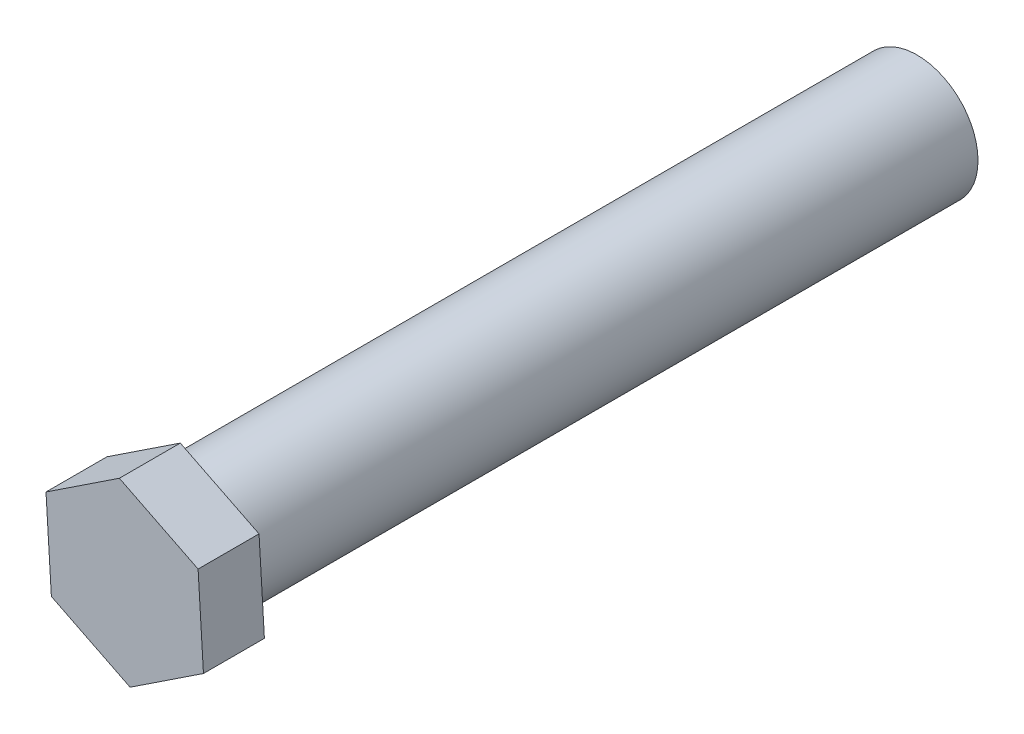
ISO-10303-21;
HEADER;
FILE_DESCRIPTION(('STEP AP214'),'2;1');
FILE_NAME('part.step','',(''),(''),'','','');
FILE_SCHEMA(('AUTOMOTIVE_DESIGN { 1 0 10303 214 1 1 1 1 }'));
ENDSEC;
DATA;
#1=APPLICATION_CONTEXT('core data for automotive mechanical design processes');
#2=APPLICATION_PROTOCOL_DEFINITION('international standard','automotive_design',2000,#1);
#3=PRODUCT_CONTEXT('',#1,'mechanical');
#4=PRODUCT('Part','Part','',(#3));
#5=PRODUCT_RELATED_PRODUCT_CATEGORY('part','',(#4));
#6=PRODUCT_DEFINITION_FORMATION('','',#4);
#7=PRODUCT_DEFINITION_CONTEXT('part definition',#1,'design');
#8=PRODUCT_DEFINITION('design','',#6,#7);
#9=PRODUCT_DEFINITION_SHAPE('','',#8);
#10=(LENGTH_UNIT() NAMED_UNIT(*) SI_UNIT(.MILLI.,.METRE.));
#11=(NAMED_UNIT(*) PLANE_ANGLE_UNIT() SI_UNIT($,.RADIAN.));
#12=(NAMED_UNIT(*) SI_UNIT($,.STERADIAN.) SOLID_ANGLE_UNIT());
#13=UNCERTAINTY_MEASURE_WITH_UNIT(LENGTH_MEASURE(1.E-05),#10,'distance_accuracy_value','');
#14=(GEOMETRIC_REPRESENTATION_CONTEXT(3) GLOBAL_UNCERTAINTY_ASSIGNED_CONTEXT((#13)) GLOBAL_UNIT_ASSIGNED_CONTEXT((#10,
#11,#12)) REPRESENTATION_CONTEXT('',''));
#15=CARTESIAN_POINT('',(0.,0.,0.));
#16=DIRECTION('',(0.,0.,1.));
#17=DIRECTION('',(1.,0.,0.));
#18=AXIS2_PLACEMENT_3D('',#15,#16,#17);
#19=CARTESIAN_POINT('',(0.,0.,-76.2));
#20=DIRECTION('',(0.,0.,1.));
#21=DIRECTION('',(1.,0.,0.));
#22=AXIS2_PLACEMENT_3D('',#19,#20,#21);
#23=CYLINDRICAL_SURFACE('',#22,6.35);
#24=CARTESIAN_POINT('',(0.,0.,-76.2));
#25=DIRECTION('',(0.,0.,1.));
#26=DIRECTION('',(1.,0.,0.));
#27=AXIS2_PLACEMENT_3D('',#24,#25,#26);
#28=CIRCLE('',#27,6.35);
#29=CARTESIAN_POINT('',(6.35,0.,-76.2));
#30=VERTEX_POINT('',#29);
#31=EDGE_CURVE('E11',#30,#30,#28,.T.);
#32=CARTESIAN_POINT('',(0.,0.,0.));
#33=DIRECTION('',(0.,0.,1.));
#34=DIRECTION('',(1.,0.,0.));
#35=AXIS2_PLACEMENT_3D('',#32,#33,#34);
#36=CIRCLE('',#35,6.35);
#37=CARTESIAN_POINT('',(6.35,0.,0.));
#38=VERTEX_POINT('',#37);
#39=EDGE_CURVE('E42',#38,#38,#36,.T.);
#40=CARTESIAN_POINT('',(6.35,0.,-76.2));
#41=CARTESIAN_POINT('',(6.35,0.,-75.40625));
#42=CARTESIAN_POINT('',(6.35,0.,-74.6125));
#43=CARTESIAN_POINT('',(6.35,0.,-73.025));
#44=CARTESIAN_POINT('',(6.35,0.,-72.23125));
#45=CARTESIAN_POINT('',(6.35,0.,-70.64375));
#46=CARTESIAN_POINT('',(6.35,0.,-69.85));
#47=CARTESIAN_POINT('',(6.35,0.,-68.2625));
#48=CARTESIAN_POINT('',(6.35,0.,-67.46875));
#49=CARTESIAN_POINT('',(6.35,0.,-65.88125));
#50=CARTESIAN_POINT('',(6.35,0.,-65.0875));
#51=CARTESIAN_POINT('',(6.35,0.,-63.5));
#52=CARTESIAN_POINT('',(6.35,0.,-62.70625));
#53=CARTESIAN_POINT('',(6.35,0.,-61.11875));
#54=CARTESIAN_POINT('',(6.35,0.,-60.325));
#55=CARTESIAN_POINT('',(6.35,0.,-58.7375));
#56=CARTESIAN_POINT('',(6.35,0.,-57.94375));
#57=CARTESIAN_POINT('',(6.35,0.,-56.35625));
#58=CARTESIAN_POINT('',(6.35,0.,-55.5625));
#59=CARTESIAN_POINT('',(6.35,0.,-53.975));
#60=CARTESIAN_POINT('',(6.35,0.,-53.18125));
#61=CARTESIAN_POINT('',(6.35,0.,-51.59375));
#62=CARTESIAN_POINT('',(6.35,0.,-50.8));
#63=CARTESIAN_POINT('',(6.35,0.,-49.2125));
#64=CARTESIAN_POINT('',(6.35,0.,-48.41875));
#65=CARTESIAN_POINT('',(6.35,0.,-46.83125));
#66=CARTESIAN_POINT('',(6.35,0.,-46.0375));
#67=CARTESIAN_POINT('',(6.35,0.,-44.45));
#68=CARTESIAN_POINT('',(6.35,0.,-43.65625));
#69=CARTESIAN_POINT('',(6.35,0.,-42.06875));
#70=CARTESIAN_POINT('',(6.35,0.,-41.275));
#71=CARTESIAN_POINT('',(6.35,0.,-39.6875));
#72=CARTESIAN_POINT('',(6.35,0.,-38.89375));
#73=CARTESIAN_POINT('',(6.35,0.,-37.30625));
#74=CARTESIAN_POINT('',(6.35,0.,-36.5125));
#75=CARTESIAN_POINT('',(6.35,0.,-34.925));
#76=CARTESIAN_POINT('',(6.35,0.,-34.13125));
#77=CARTESIAN_POINT('',(6.35,0.,-32.54375));
#78=CARTESIAN_POINT('',(6.35,0.,-31.75));
#79=CARTESIAN_POINT('',(6.35,0.,-30.1625));
#80=CARTESIAN_POINT('',(6.35,0.,-29.36875));
#81=CARTESIAN_POINT('',(6.35,0.,-27.78125));
#82=CARTESIAN_POINT('',(6.35,0.,-26.9875));
#83=CARTESIAN_POINT('',(6.35,0.,-25.4));
#84=CARTESIAN_POINT('',(6.35,0.,-24.60625));
#85=CARTESIAN_POINT('',(6.35,0.,-23.01875));
#86=CARTESIAN_POINT('',(6.35,0.,-22.225));
#87=CARTESIAN_POINT('',(6.35,0.,-20.6375));
#88=CARTESIAN_POINT('',(6.35,0.,-19.84375));
#89=CARTESIAN_POINT('',(6.35,0.,-18.25625));
#90=CARTESIAN_POINT('',(6.35,0.,-17.4625));
#91=CARTESIAN_POINT('',(6.35,0.,-15.875));
#92=CARTESIAN_POINT('',(6.35,0.,-15.08125));
#93=CARTESIAN_POINT('',(6.35,0.,-13.49375));
#94=CARTESIAN_POINT('',(6.35,0.,-12.7));
#95=CARTESIAN_POINT('',(6.35,0.,-11.1125));
#96=CARTESIAN_POINT('',(6.35,0.,-10.31875));
#97=CARTESIAN_POINT('',(6.35,0.,-8.73125));
#98=CARTESIAN_POINT('',(6.35,0.,-7.93750000000001));
#99=CARTESIAN_POINT('',(6.35,0.,-6.35));
#100=CARTESIAN_POINT('',(6.35,0.,-5.55625));
#101=CARTESIAN_POINT('',(6.35,0.,-3.96875));
#102=CARTESIAN_POINT('',(6.35,0.,-3.175));
#103=CARTESIAN_POINT('',(6.35,0.,-1.5875));
#104=CARTESIAN_POINT('',(6.35,0.,-0.793750000000001));
#105=CARTESIAN_POINT('',(6.35,0.,0.));
#106=B_SPLINE_CURVE_WITH_KNOTS('',3,(#40,#41,#42,#43,#44,#45,#46,#47,#48,#49,#50,#51,#52,#53,
#54,#55,#56,#57,#58,#59,#60,#61,#62,#63,#64,#65,#66,#67,#68,#69,#70,#71,#72,#73,#74,#75,#76,#77,
#78,#79,#80,#81,#82,#83,#84,#85,#86,#87,#88,#89,#90,#91,#92,#93,#94,#95,#96,#97,#98,#99,#100,
#101,#102,#103,#104,#105),.UNSPECIFIED.,.F.,.F.,(4,2,2,2,2,2,2,2,2,2,2,2,2,2,2,2,2,2,2,2,2,2,2,
2,2,2,2,2,2,2,2,2,4),(0.,2.38125,4.7625,7.14375,9.52500000000001,11.90625,14.2875,16.66875,
19.05,21.43125,23.8125,26.19375,28.575,30.95625,33.3375,35.71875,38.1,40.48125,42.8625,45.24375,
47.625,50.00625,52.3875,54.76875,57.15,59.53125,61.9125,64.29375,66.675,69.05625,71.4375,
73.81875,76.2),.UNSPECIFIED.);
#107=EDGE_CURVE('BSEAM39',#30,#38,#106,.T.);
#108=ORIENTED_EDGE('',*,*,#31,.T.);
#109=ORIENTED_EDGE('',*,*,#39,.F.);
#110=ORIENTED_EDGE('',*,*,#107,.T.);
#111=ORIENTED_EDGE('',*,*,#107,.F.);
#112=EDGE_LOOP('',(#108,#110,#109,#111));
#113=FACE_BOUND('',#112,.T.);
#114=ADVANCED_FACE('F39',(#113),#23,.T.);
#115=CARTESIAN_POINT('',(0.,0.,-76.2));
#116=DIRECTION('',(0.,0.,1.));
#117=DIRECTION('',(1.,0.,0.));
#118=AXIS2_PLACEMENT_3D('',#115,#116,#117);
#119=PLANE('',#118);
#120=ORIENTED_EDGE('',*,*,#31,.F.);
#121=EDGE_LOOP('',(#120));
#122=FACE_BOUND('',#121,.T.);
#123=ADVANCED_FACE('F167',(#122),#119,.F.);
#124=CARTESIAN_POINT('',(0.559433711956197,-9.14834642190928,6.35));
#125=DIRECTION('',(-0.551927620278942,0.833892020571742,0.));
#126=DIRECTION('',(-0.833892020571743,-0.551927620278942,0.));
#127=AXIS2_PLACEMENT_3D('',#124,#125,#126);
#128=PLANE('',#127);
#129=DIRECTION('',(0.833892020571742,0.551927620278942,0.));
#130=VECTOR('',#129,1.);
#131=CARTESIAN_POINT('',(0.559433711956197,-9.14834642190928,0.));
#132=LINE('',#131,#130);
#133=CARTESIAN_POINT('',(0.559433711956197,-9.14834642190928,0.));
#134=VERTEX_POINT('',#133);
#135=CARTESIAN_POINT('',(8.202417259972,-4.08968940466714,0.));
#136=VERTEX_POINT('',#135);
#137=EDGE_CURVE('E129',#134,#136,#132,.T.);
#138=ORIENTED_EDGE('',*,*,#137,.T.);
#139=DIRECTION('',(0.,0.,-1.));
#140=VECTOR('',#139,1.);
#141=CARTESIAN_POINT('',(8.202417259972,-4.08968940466714,6.35));
#142=LINE('',#141,#140);
#143=CARTESIAN_POINT('',(8.202417259972,-4.08968940466714,6.35));
#144=VERTEX_POINT('',#143);
#145=EDGE_CURVE('E156',#144,#136,#142,.T.);
#146=ORIENTED_EDGE('',*,*,#145,.F.);
#147=DIRECTION('',(0.833892020571742,0.551927620278942,0.));
#148=VECTOR('',#147,1.);
#149=CARTESIAN_POINT('',(0.559433711956197,-9.14834642190928,6.35));
#150=LINE('',#149,#148);
#151=CARTESIAN_POINT('',(0.559433711956197,-9.14834642190928,6.35));
#152=VERTEX_POINT('',#151);
#153=EDGE_CURVE('E145',#152,#144,#150,.T.);
#154=ORIENTED_EDGE('',*,*,#153,.F.);
#155=DIRECTION('',(0.,0.,-1.));
#156=VECTOR('',#155,1.);
#157=CARTESIAN_POINT('',(0.559433711956197,-9.14834642190928,6.35));
#158=LINE('',#157,#156);
#159=EDGE_CURVE('E125',#152,#134,#158,.T.);
#160=ORIENTED_EDGE('',*,*,#159,.T.);
#161=EDGE_LOOP('',(#138,#146,#154,#160));
#162=FACE_BOUND('',#161,.T.);
#163=ADVANCED_FACE('F172',(#162),#128,.F.);
#164=CARTESIAN_POINT('',(8.202417259972,-4.08968940466714,6.35));
#165=DIRECTION('',(-0.998135483967736,-0.0610373299259838,0.));
#166=DIRECTION('',(0.0610373299259838,-0.998135483967736,0.));
#167=AXIS2_PLACEMENT_3D('',#164,#165,#166);
#168=PLANE('',#167);
#169=DIRECTION('',(-0.0610373299259838,0.998135483967736,0.));
#170=VECTOR('',#169,1.);
#171=CARTESIAN_POINT('',(8.202417259972,-4.08968940466714,0.));
#172=LINE('',#171,#170);
#173=CARTESIAN_POINT('',(7.6429835480158,5.05865701724214,0.));
#174=VERTEX_POINT('',#173);
#175=EDGE_CURVE('E133',#136,#174,#172,.T.);
#176=ORIENTED_EDGE('',*,*,#175,.T.);
#177=DIRECTION('',(0.,0.,-1.));
#178=VECTOR('',#177,1.);
#179=CARTESIAN_POINT('',(7.6429835480158,5.05865701724214,6.35));
#180=LINE('',#179,#178);
#181=CARTESIAN_POINT('',(7.6429835480158,5.05865701724214,6.35));
#182=VERTEX_POINT('',#181);
#183=EDGE_CURVE('E152',#182,#174,#180,.T.);
#184=ORIENTED_EDGE('',*,*,#183,.F.);
#185=DIRECTION('',(-0.0610373299259838,0.998135483967736,0.));
#186=VECTOR('',#185,1.);
#187=CARTESIAN_POINT('',(8.202417259972,-4.08968940466714,6.35));
#188=LINE('',#187,#186);
#189=EDGE_CURVE('E94',#144,#182,#188,.T.);
#190=ORIENTED_EDGE('',*,*,#189,.F.);
#191=ORIENTED_EDGE('',*,*,#145,.T.);
#192=EDGE_LOOP('',(#176,#184,#190,#191));
#193=FACE_BOUND('',#192,.T.);
#194=ADVANCED_FACE('F178',(#193),#168,.F.);
#195=CARTESIAN_POINT('',(7.6429835480158,5.05865701724214,6.35));
#196=DIRECTION('',(-0.446207863688794,-0.894929350497726,0.));
#197=DIRECTION('',(0.894929350497727,-0.446207863688794,0.));
#198=AXIS2_PLACEMENT_3D('',#195,#196,#197);
#199=PLANE('',#198);
#200=DIRECTION('',(-0.894929350497726,0.446207863688794,0.));
#201=VECTOR('',#200,1.);
#202=CARTESIAN_POINT('',(7.6429835480158,5.05865701724214,0.));
#203=LINE('',#202,#201);
#204=CARTESIAN_POINT('',(-0.559433711956197,9.14834642190928,0.));
#205=VERTEX_POINT('',#204);
#206=EDGE_CURVE('E136',#174,#205,#203,.T.);
#207=ORIENTED_EDGE('',*,*,#206,.T.);
#208=DIRECTION('',(0.,0.,-1.));
#209=VECTOR('',#208,1.);
#210=CARTESIAN_POINT('',(-0.559433711956197,9.14834642190928,6.35));
#211=LINE('',#210,#209);
#212=CARTESIAN_POINT('',(-0.559433711956197,9.14834642190928,6.35));
#213=VERTEX_POINT('',#212);
#214=EDGE_CURVE('E118',#213,#205,#211,.T.);
#215=ORIENTED_EDGE('',*,*,#214,.F.);
#216=DIRECTION('',(-0.894929350497726,0.446207863688794,0.));
#217=VECTOR('',#216,1.);
#218=CARTESIAN_POINT('',(7.6429835480158,5.05865701724214,6.35));
#219=LINE('',#218,#217);
#220=EDGE_CURVE('E107',#182,#213,#219,.T.);
#221=ORIENTED_EDGE('',*,*,#220,.F.);
#222=ORIENTED_EDGE('',*,*,#183,.T.);
#223=EDGE_LOOP('',(#207,#215,#221,#222));
#224=FACE_BOUND('',#223,.T.);
#225=ADVANCED_FACE('F184',(#224),#199,.F.);
#226=CARTESIAN_POINT('',(-0.559433711956197,9.14834642190928,6.35));
#227=DIRECTION('',(0.551927620278942,-0.833892020571743,0.));
#228=DIRECTION('',(0.833892020571743,0.551927620278942,0.));
#229=AXIS2_PLACEMENT_3D('',#226,#227,#228);
#230=PLANE('',#229);
#231=DIRECTION('',(-0.833892020571743,-0.551927620278942,0.));
#232=VECTOR('',#231,1.);
#233=CARTESIAN_POINT('',(-0.559433711956197,9.14834642190928,0.));
#234=LINE('',#233,#232);
#235=CARTESIAN_POINT('',(-8.20241725997201,4.08968940466714,0.));
#236=VERTEX_POINT('',#235);
#237=EDGE_CURVE('E116',#205,#236,#234,.T.);
#238=ORIENTED_EDGE('',*,*,#237,.T.);
#239=DIRECTION('',(0.,0.,-1.));
#240=VECTOR('',#239,1.);
#241=CARTESIAN_POINT('',(-8.20241725997201,4.08968940466714,6.35));
#242=LINE('',#241,#240);
#243=CARTESIAN_POINT('',(-8.20241725997201,4.08968940466714,6.35));
#244=VERTEX_POINT('',#243);
#245=EDGE_CURVE('E113',#244,#236,#242,.T.);
#246=ORIENTED_EDGE('',*,*,#245,.F.);
#247=DIRECTION('',(-0.833892020571743,-0.551927620278942,0.));
#248=VECTOR('',#247,1.);
#249=CARTESIAN_POINT('',(-0.559433711956197,9.14834642190928,6.35));
#250=LINE('',#249,#248);
#251=EDGE_CURVE('E101',#213,#244,#250,.T.);
#252=ORIENTED_EDGE('',*,*,#251,.F.);
#253=ORIENTED_EDGE('',*,*,#214,.T.);
#254=EDGE_LOOP('',(#238,#246,#252,#253));
#255=FACE_BOUND('',#254,.T.);
#256=ADVANCED_FACE('F114',(#255),#230,.F.);
#257=CARTESIAN_POINT('',(-8.20241725997201,4.08968940466714,6.35));
#258=DIRECTION('',(0.998135483967736,0.0610373299259837,0.));
#259=DIRECTION('',(-0.0610373299259837,0.998135483967736,0.));
#260=AXIS2_PLACEMENT_3D('',#257,#258,#259);
#261=PLANE('',#260);
#262=DIRECTION('',(0.0610373299259837,-0.998135483967736,0.));
#263=VECTOR('',#262,1.);
#264=CARTESIAN_POINT('',(-8.20241725997201,4.08968940466714,0.));
#265=LINE('',#264,#263);
#266=CARTESIAN_POINT('',(-7.64298354801581,-5.05865701724214,0.));
#267=VERTEX_POINT('',#266);
#268=EDGE_CURVE('E79',#236,#267,#265,.T.);
#269=ORIENTED_EDGE('',*,*,#268,.T.);
#270=DIRECTION('',(0.,0.,-1.));
#271=VECTOR('',#270,1.);
#272=CARTESIAN_POINT('',(-7.64298354801581,-5.05865701724214,6.35));
#273=LINE('',#272,#271);
#274=CARTESIAN_POINT('',(-7.64298354801581,-5.05865701724214,6.35));
#275=VERTEX_POINT('',#274);
#276=EDGE_CURVE('E119',#275,#267,#273,.T.);
#277=ORIENTED_EDGE('',*,*,#276,.F.);
#278=DIRECTION('',(0.0610373299259837,-0.998135483967736,0.));
#279=VECTOR('',#278,1.);
#280=CARTESIAN_POINT('',(-8.20241725997201,4.08968940466714,6.35));
#281=LINE('',#280,#279);
#282=EDGE_CURVE('E105',#244,#275,#281,.T.);
#283=ORIENTED_EDGE('',*,*,#282,.F.);
#284=ORIENTED_EDGE('',*,*,#245,.T.);
#285=EDGE_LOOP('',(#269,#277,#283,#284));
#286=FACE_BOUND('',#285,.T.);
#287=ADVANCED_FACE('F121',(#286),#261,.F.);
#288=CARTESIAN_POINT('',(-7.64298354801581,-5.05865701724214,6.35));
#289=DIRECTION('',(0.446207863688794,0.894929350497726,0.));
#290=DIRECTION('',(-0.894929350497726,0.446207863688794,0.));
#291=AXIS2_PLACEMENT_3D('',#288,#289,#290);
#292=PLANE('',#291);
#293=DIRECTION('',(0.894929350497726,-0.446207863688794,0.));
#294=VECTOR('',#293,1.);
#295=CARTESIAN_POINT('',(-7.64298354801581,-5.05865701724214,0.));
#296=LINE('',#295,#294);
#297=EDGE_CURVE('E85',#267,#134,#296,.T.);
#298=ORIENTED_EDGE('',*,*,#297,.T.);
#299=ORIENTED_EDGE('',*,*,#159,.F.);
#300=DIRECTION('',(0.894929350497726,-0.446207863688794,0.));
#301=VECTOR('',#300,1.);
#302=CARTESIAN_POINT('',(-7.64298354801581,-5.05865701724214,6.35));
#303=LINE('',#302,#301);
#304=EDGE_CURVE('E56',#275,#152,#303,.T.);
#305=ORIENTED_EDGE('',*,*,#304,.F.);
#306=ORIENTED_EDGE('',*,*,#276,.T.);
#307=EDGE_LOOP('',(#298,#299,#305,#306));
#308=FACE_BOUND('',#307,.T.);
#309=ADVANCED_FACE('F192',(#308),#292,.F.);
#310=CARTESIAN_POINT('',(0.,0.,6.35));
#311=DIRECTION('',(0.,0.,1.));
#312=DIRECTION('',(1.,0.,0.));
#313=AXIS2_PLACEMENT_3D('',#310,#311,#312);
#314=PLANE('',#313);
#315=ORIENTED_EDGE('',*,*,#153,.T.);
#316=ORIENTED_EDGE('',*,*,#189,.T.);
#317=ORIENTED_EDGE('',*,*,#220,.T.);
#318=ORIENTED_EDGE('',*,*,#251,.T.);
#319=ORIENTED_EDGE('',*,*,#282,.T.);
#320=ORIENTED_EDGE('',*,*,#304,.T.);
#321=EDGE_LOOP('',(#315,#316,#317,#318,#319,#320));
#322=FACE_BOUND('',#321,.T.);
#323=ADVANCED_FACE('F103',(#322),#314,.T.);
#324=CARTESIAN_POINT('',(0.,0.,0.));
#325=DIRECTION('',(0.,0.,1.));
#326=DIRECTION('',(1.,0.,0.));
#327=AXIS2_PLACEMENT_3D('',#324,#325,#326);
#328=PLANE('',#327);
#329=ORIENTED_EDGE('',*,*,#39,.T.);
#330=EDGE_LOOP('',(#329));
#331=FACE_BOUND('',#330,.T.);
#332=ORIENTED_EDGE('',*,*,#137,.F.);
#333=ORIENTED_EDGE('',*,*,#297,.F.);
#334=ORIENTED_EDGE('',*,*,#268,.F.);
#335=ORIENTED_EDGE('',*,*,#237,.F.);
#336=ORIENTED_EDGE('',*,*,#206,.F.);
#337=ORIENTED_EDGE('',*,*,#175,.F.);
#338=EDGE_LOOP('',(#332,#333,#334,#335,#336,#337));
#339=FACE_BOUND('',#338,.T.);
#340=ADVANCED_FACE('F163',(#331,#339),#328,.F.);
#341=CLOSED_SHELL('',(#114,#123,#163,#194,#225,#256,#287,#309,#323,#340));
#342=MANIFOLD_SOLID_BREP('B2',#341);
#343=ADVANCED_BREP_SHAPE_REPRESENTATION('',(#18,#342),#14);
#344=SHAPE_DEFINITION_REPRESENTATION(#9,#343);
ENDSEC;
END-ISO-10303-21;
